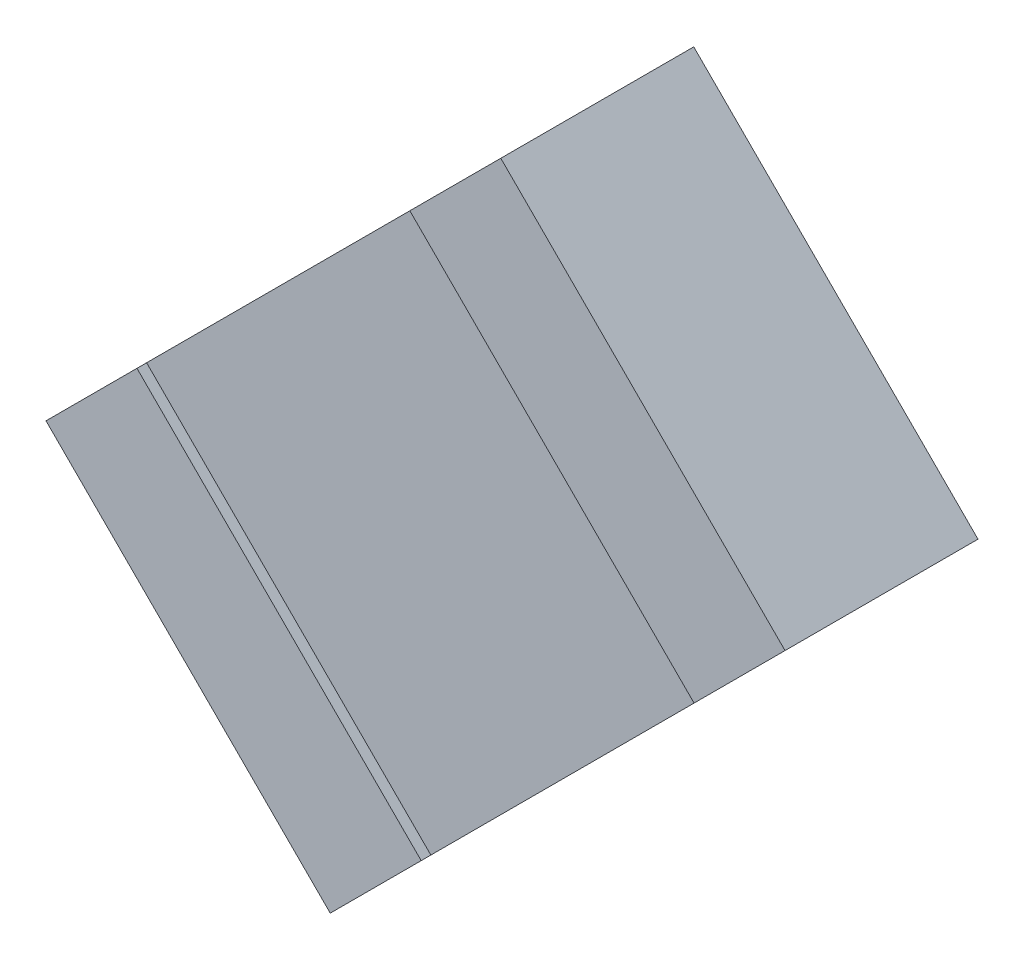
ISO-10303-21;
HEADER;
FILE_DESCRIPTION(('STEP AP214'),'2;1');
FILE_NAME('part.step','',(''),(''),'','','');
FILE_SCHEMA(('AUTOMOTIVE_DESIGN { 1 0 10303 214 1 1 1 1 }'));
ENDSEC;
DATA;
#1=APPLICATION_CONTEXT('core data for automotive mechanical design processes');
#2=APPLICATION_PROTOCOL_DEFINITION('international standard','automotive_design',2000,#1);
#3=PRODUCT_CONTEXT('',#1,'mechanical');
#4=PRODUCT('Part','Part','',(#3));
#5=PRODUCT_RELATED_PRODUCT_CATEGORY('part','',(#4));
#6=PRODUCT_DEFINITION_FORMATION('','',#4);
#7=PRODUCT_DEFINITION_CONTEXT('part definition',#1,'design');
#8=PRODUCT_DEFINITION('design','',#6,#7);
#9=PRODUCT_DEFINITION_SHAPE('','',#8);
#10=(LENGTH_UNIT() NAMED_UNIT(*) SI_UNIT(.MILLI.,.METRE.));
#11=(NAMED_UNIT(*) PLANE_ANGLE_UNIT() SI_UNIT($,.RADIAN.));
#12=(NAMED_UNIT(*) SI_UNIT($,.STERADIAN.) SOLID_ANGLE_UNIT());
#13=UNCERTAINTY_MEASURE_WITH_UNIT(LENGTH_MEASURE(1.E-05),#10,'distance_accuracy_value','');
#14=(GEOMETRIC_REPRESENTATION_CONTEXT(3) GLOBAL_UNCERTAINTY_ASSIGNED_CONTEXT((#13)) GLOBAL_UNIT_ASSIGNED_CONTEXT((#10,
#11,#12)) REPRESENTATION_CONTEXT('',''));
#15=CARTESIAN_POINT('',(0.,0.,0.));
#16=DIRECTION('',(0.,0.,1.));
#17=DIRECTION('',(1.,0.,0.));
#18=AXIS2_PLACEMENT_3D('',#15,#16,#17);
#19=CARTESIAN_POINT('',(-21.9197411277336,-0.377089043300944,1.04805716622663E-06));
#20=DIRECTION('',(-0.707106781186547,0.707106781186547,1.81058576561484E-08));
#21=DIRECTION('',(0.707106781186545,0.707106781186545,6.18172119636202E-08));
#22=AXIS2_PLACEMENT_3D('',#19,#20,#21);
#23=PLANE('',#22);
#24=DIRECTION('',(3.09085950456612E-08,5.65141445013829E-08,-1.));
#25=VECTOR('',#24,1.);
#26=CARTESIAN_POINT('',(-21.4954770580944,0.0471750271064109,-0.0299989148525065));
#27=LINE('',#26,#25);
#28=CARTESIAN_POINT('',(-21.4954770590217,0.0471750254109893,1.08514749313018E-06));
#29=VERTEX_POINT('',#28);
#30=CARTESIAN_POINT('',(-21.4954770580944,0.0471750271064109,-0.0299989148525065));
#31=VERTEX_POINT('',#30);
#32=EDGE_CURVE('P0_E105',#29,#31,#27,.T.);
#33=ORIENTED_EDGE('',*,*,#32,.F.);
#34=DIRECTION('',(-0.707106781186545,-0.707106781186545,-6.18172122697819E-08));
#35=VECTOR('',#34,1.);
#36=CARTESIAN_POINT('',(-21.4954770590217,0.0471750254109893,1.08514749313018E-06));
#37=LINE('',#36,#35);
#38=CARTESIAN_POINT('',(-21.2126343465471,0.330017737885602,1.10987437816623E-06));
#39=VERTEX_POINT('',#38);
#40=EDGE_CURVE('P0_E28',#39,#29,#37,.T.);
#41=ORIENTED_EDGE('',*,*,#40,.F.);
#42=DIRECTION('',(-3.09085950456612E-08,-5.65141445013829E-08,1.));
#43=VECTOR('',#42,1.);
#44=CARTESIAN_POINT('',(-21.2126343465471,0.330017737885602,1.10987437816623E-06));
#45=LINE('',#44,#43);
#46=CARTESIAN_POINT('',(-21.2126343280019,0.330017771794089,-0.599998890125621));
#47=VERTEX_POINT('',#46);
#48=EDGE_CURVE('P0_E82',#47,#39,#45,.T.);
#49=ORIENTED_EDGE('',*,*,#48,.F.);
#50=DIRECTION('',(0.707106781186545,0.707106781186545,6.18172119636202E-08));
#51=VECTOR('',#50,1.);
#52=CARTESIAN_POINT('',(-21.2126343280019,0.330017771794089,-0.599998890125621));
#53=LINE('',#52,#51);
#54=CARTESIAN_POINT('',(-21.4954770404765,0.0471750593194764,-0.599998914852506));
#55=VERTEX_POINT('',#54);
#56=EDGE_CURVE('P0_E75',#55,#47,#53,.T.);
#57=ORIENTED_EDGE('',*,*,#56,.F.);
#58=CARTESIAN_POINT('',(-21.4954770414038,0.0471750576240548,-0.569998914852506));
#59=VERTEX_POINT('',#58);
#60=EDGE_CURVE('P0_E79',#59,#55,#27,.T.);
#61=ORIENTED_EDGE('',*,*,#60,.F.);
#62=DIRECTION('',(-0.707106781186545,-0.707106781186545,-6.18172119636202E-08));
#63=VECTOR('',#62,1.);
#64=CARTESIAN_POINT('',(-21.2338475323648,0.308804566663073,-0.569998891980138));
#65=LINE('',#64,#63);
#66=CARTESIAN_POINT('',(-21.2338475323648,0.308804566663073,-0.569998891980138));
#67=VERTEX_POINT('',#66);
#68=EDGE_CURVE('P0_E120',#67,#59,#65,.T.);
#69=ORIENTED_EDGE('',*,*,#68,.F.);
#70=DIRECTION('',(3.09085950456612E-08,5.65141445013829E-08,-1.));
#71=VECTOR('',#70,1.);
#72=CARTESIAN_POINT('',(-21.2338475490554,0.30880453614543,-0.029998891980138));
#73=LINE('',#72,#71);
#74=CARTESIAN_POINT('',(-21.2338475490554,0.30880453614543,-0.029998891980138));
#75=VERTEX_POINT('',#74);
#76=EDGE_CURVE('P0_E126',#75,#67,#73,.T.);
#77=ORIENTED_EDGE('',*,*,#76,.F.);
#78=DIRECTION('',(0.707106781186545,0.707106781186545,6.18172120826627E-08));
#79=VECTOR('',#78,1.);
#80=CARTESIAN_POINT('',(-21.4954770580944,0.0471750271064109,-0.0299989148525065));
#81=LINE('',#80,#79);
#82=EDGE_CURVE('P0_E134',#31,#75,#81,.T.);
#83=ORIENTED_EDGE('',*,*,#82,.F.);
#84=EDGE_LOOP('',(#33,#41,#49,#57,#61,#69,#77,#83));
#85=FACE_BOUND('',#84,.T.);
#86=ADVANCED_FACE('P0_F17',(#85),#23,.T.);
#87=CARTESIAN_POINT('',(-21.0358576512505,-1.26097251978413,1.02542484399504E-06));
#88=DIRECTION('',(-0.707106781186547,0.707106781186547,1.81058576561484E-08));
#89=DIRECTION('',(0.707106781186545,0.707106781186545,6.18172119636202E-08));
#90=AXIS2_PLACEMENT_3D('',#87,#88,#89);
#91=PLANE('',#90);
#92=DIRECTION('',(3.09085950456612E-08,5.65141445013829E-08,-1.));
#93=VECTOR('',#92,1.);
#94=CARTESIAN_POINT('',(-20.6115935816112,-0.836708449376777,-0.0299989374848287));
#95=LINE('',#94,#93);
#96=CARTESIAN_POINT('',(-20.6115935825385,-0.836708451072199,1.06251517133227E-06));
#97=VERTEX_POINT('',#96);
#98=CARTESIAN_POINT('',(-20.6115935816112,-0.836708449376777,-0.0299989374848287));
#99=VERTEX_POINT('',#98);
#100=EDGE_CURVE('P0_E180',#97,#99,#95,.T.);
#101=ORIENTED_EDGE('',*,*,#100,.T.);
#102=DIRECTION('',(0.707106781186545,0.707106781186545,6.18172120826627E-08));
#103=VECTOR('',#102,1.);
#104=CARTESIAN_POINT('',(-20.6115935816112,-0.836708449376777,-0.0299989374848287));
#105=LINE('',#104,#103);
#106=CARTESIAN_POINT('',(-20.3499640725723,-0.575078940337759,-0.0299989146124603));
#107=VERTEX_POINT('',#106);
#108=EDGE_CURVE('P0_E131',#99,#107,#105,.T.);
#109=ORIENTED_EDGE('',*,*,#108,.T.);
#110=DIRECTION('',(3.09085950456612E-08,5.65141445013829E-08,-1.));
#111=VECTOR('',#110,1.);
#112=CARTESIAN_POINT('',(-20.3499640725723,-0.575078940337759,-0.0299989146124603));
#113=LINE('',#112,#111);
#114=CARTESIAN_POINT('',(-20.3499640558816,-0.575078909820115,-0.56999891461246));
#115=VERTEX_POINT('',#114);
#116=EDGE_CURVE('P0_E123',#107,#115,#113,.T.);
#117=ORIENTED_EDGE('',*,*,#116,.T.);
#118=DIRECTION('',(-0.707106781186545,-0.707106781186545,-6.18172119636202E-08));
#119=VECTOR('',#118,1.);
#120=CARTESIAN_POINT('',(-20.3499640558816,-0.575078909820115,-0.56999891461246));
#121=LINE('',#120,#119);
#122=CARTESIAN_POINT('',(-20.6115935649206,-0.836708418859133,-0.569998937484828));
#123=VERTEX_POINT('',#122);
#124=EDGE_CURVE('P0_E96',#115,#123,#121,.T.);
#125=ORIENTED_EDGE('',*,*,#124,.T.);
#126=DIRECTION('',(3.09085950456612E-08,5.65141445013829E-08,-1.));
#127=VECTOR('',#126,1.);
#128=CARTESIAN_POINT('',(-20.6115935825385,-0.836708451072199,1.06251517133227E-06));
#129=LINE('',#128,#127);
#130=CARTESIAN_POINT('',(-20.6115935639933,-0.836708417163712,-0.599998937484828));
#131=VERTEX_POINT('',#130);
#132=EDGE_CURVE('P0_E86',#123,#131,#129,.T.);
#133=ORIENTED_EDGE('',*,*,#132,.T.);
#134=DIRECTION('',(0.707106781186545,0.707106781186545,6.18172119636202E-08));
#135=VECTOR('',#134,1.);
#136=CARTESIAN_POINT('',(-20.3287508515188,-0.553865704689099,-0.599998912757944));
#137=LINE('',#136,#135);
#138=CARTESIAN_POINT('',(-20.3287508515188,-0.553865704689099,-0.599998912757944));
#139=VERTEX_POINT('',#138);
#140=EDGE_CURVE('P0_E67',#131,#139,#137,.T.);
#141=ORIENTED_EDGE('',*,*,#140,.T.);
#142=DIRECTION('',(-3.09085950456612E-08,-5.65141445013829E-08,1.));
#143=VECTOR('',#142,1.);
#144=CARTESIAN_POINT('',(-20.3287508700639,-0.553865738597587,1.08724205636831E-06));
#145=LINE('',#144,#143);
#146=CARTESIAN_POINT('',(-20.3287508700639,-0.553865738597587,1.08724205636831E-06));
#147=VERTEX_POINT('',#146);
#148=EDGE_CURVE('P0_E110',#139,#147,#145,.T.);
#149=ORIENTED_EDGE('',*,*,#148,.T.);
#150=DIRECTION('',(-0.707106781186545,-0.707106781186545,-6.18172122697819E-08));
#151=VECTOR('',#150,1.);
#152=CARTESIAN_POINT('',(-20.6115935825385,-0.836708451072199,1.06251517133227E-06));
#153=LINE('',#152,#151);
#154=EDGE_CURVE('P0_E11',#147,#97,#153,.T.);
#155=ORIENTED_EDGE('',*,*,#154,.T.);
#156=EDGE_LOOP('',(#101,#109,#117,#125,#133,#141,#149,#155));
#157=FACE_BOUND('',#156,.T.);
#158=ADVANCED_FACE('P0_F146',(#157),#91,.F.);
#159=CARTESIAN_POINT('',(-20.6115935825385,-0.836708451072199,1.06251517133227E-06));
#160=DIRECTION('',(3.09085952621502E-08,5.6514144717872E-08,-1.));
#161=DIRECTION('',(0.707106781186545,0.707106781186545,6.18172122697819E-08));
#162=AXIS2_PLACEMENT_3D('',#159,#160,#161);
#163=PLANE('',#162);
#164=ORIENTED_EDGE('',*,*,#40,.T.);
#165=DIRECTION('',(-0.707106781186547,0.707106781186547,1.81058576561484E-08));
#166=VECTOR('',#165,1.);
#167=CARTESIAN_POINT('',(-20.6115935825385,-0.836708451072199,1.06251517133227E-06));
#168=LINE('',#167,#166);
#169=EDGE_CURVE('P0_E139',#97,#29,#168,.T.);
#170=ORIENTED_EDGE('',*,*,#169,.F.);
#171=ORIENTED_EDGE('',*,*,#154,.F.);
#172=DIRECTION('',(-0.707106781186547,0.707106781186547,1.81058576561484E-08));
#173=VECTOR('',#172,1.);
#174=CARTESIAN_POINT('',(-20.3287508700639,-0.553865738597587,1.08724205636831E-06));
#175=LINE('',#174,#173);
#176=EDGE_CURVE('P0_E115',#147,#39,#175,.T.);
#177=ORIENTED_EDGE('',*,*,#176,.T.);
#178=EDGE_LOOP('',(#164,#170,#171,#177));
#179=FACE_BOUND('',#178,.T.);
#180=ADVANCED_FACE('P0_F205',(#179),#163,.F.);
#181=CARTESIAN_POINT('',(-20.3287508700639,-0.553865738597587,1.08724205636831E-06));
#182=DIRECTION('',(-0.707106781186545,-0.707106781186545,-6.18172119636202E-08));
#183=DIRECTION('',(-0.707106781186547,0.707106781186547,1.81058576561484E-08));
#184=AXIS2_PLACEMENT_3D('',#181,#182,#183);
#185=PLANE('',#184);
#186=ORIENTED_EDGE('',*,*,#48,.T.);
#187=ORIENTED_EDGE('',*,*,#176,.F.);
#188=ORIENTED_EDGE('',*,*,#148,.F.);
#189=DIRECTION('',(-0.707106781186547,0.707106781186547,1.81058576561484E-08));
#190=VECTOR('',#189,1.);
#191=CARTESIAN_POINT('',(-20.3287508515188,-0.553865704689099,-0.599998912757944));
#192=LINE('',#191,#190);
#193=EDGE_CURVE('P0_E85',#139,#47,#192,.T.);
#194=ORIENTED_EDGE('',*,*,#193,.T.);
#195=EDGE_LOOP('',(#186,#187,#188,#194));
#196=FACE_BOUND('',#195,.T.);
#197=ADVANCED_FACE('P0_F214',(#196),#185,.F.);
#198=CARTESIAN_POINT('',(-20.3287508515188,-0.553865704689099,-0.599998912757944));
#199=DIRECTION('',(-3.09085950456612E-08,-5.65141445013829E-08,1.));
#200=DIRECTION('',(-0.707106781186547,0.707106781186547,1.81058576561484E-08));
#201=AXIS2_PLACEMENT_3D('',#198,#199,#200);
#202=PLANE('',#201);
#203=ORIENTED_EDGE('',*,*,#56,.T.);
#204=ORIENTED_EDGE('',*,*,#193,.F.);
#205=ORIENTED_EDGE('',*,*,#140,.F.);
#206=DIRECTION('',(-0.707106781186547,0.707106781186547,1.81058576561484E-08));
#207=VECTOR('',#206,1.);
#208=CARTESIAN_POINT('',(-20.6115935639933,-0.836708417163712,-0.599998937484828));
#209=LINE('',#208,#207);
#210=EDGE_CURVE('P0_E89',#131,#55,#209,.T.);
#211=ORIENTED_EDGE('',*,*,#210,.T.);
#212=EDGE_LOOP('',(#203,#204,#205,#211));
#213=FACE_BOUND('',#212,.T.);
#214=ADVANCED_FACE('P0_F90',(#213),#202,.F.);
#215=CARTESIAN_POINT('',(-20.6115935816112,-0.836708449376777,-0.0299989374848287));
#216=DIRECTION('',(0.707106781186545,0.707106781186545,6.18172119636202E-08));
#217=DIRECTION('',(0.707106781186547,-0.707106781186547,-1.81058576561484E-08));
#218=AXIS2_PLACEMENT_3D('',#215,#216,#217);
#219=PLANE('',#218);
#220=ORIENTED_EDGE('',*,*,#60,.T.);
#221=ORIENTED_EDGE('',*,*,#210,.F.);
#222=ORIENTED_EDGE('',*,*,#132,.F.);
#223=DIRECTION('',(-0.707106781186547,0.707106781186547,1.81058576561484E-08));
#224=VECTOR('',#223,1.);
#225=CARTESIAN_POINT('',(-20.6115935649206,-0.836708418859133,-0.569998937484828));
#226=LINE('',#225,#224);
#227=EDGE_CURVE('P0_E21',#123,#59,#226,.T.);
#228=ORIENTED_EDGE('',*,*,#227,.T.);
#229=EDGE_LOOP('',(#220,#221,#222,#228));
#230=FACE_BOUND('',#229,.T.);
#231=ADVANCED_FACE('P0_F19',(#230),#219,.F.);
#232=CARTESIAN_POINT('',(-20.3499640558816,-0.575078909820115,-0.56999891461246));
#233=DIRECTION('',(3.09085950456612E-08,5.65141445013829E-08,-1.));
#234=DIRECTION('',(0.707106781186547,-0.707106781186547,-1.81058576561484E-08));
#235=AXIS2_PLACEMENT_3D('',#232,#233,#234);
#236=PLANE('',#235);
#237=ORIENTED_EDGE('',*,*,#68,.T.);
#238=ORIENTED_EDGE('',*,*,#227,.F.);
#239=ORIENTED_EDGE('',*,*,#124,.F.);
#240=DIRECTION('',(-0.707106781186547,0.707106781186547,1.81058576561484E-08));
#241=VECTOR('',#240,1.);
#242=CARTESIAN_POINT('',(-20.3499640558816,-0.575078909820115,-0.56999891461246));
#243=LINE('',#242,#241);
#244=EDGE_CURVE('P0_E130',#115,#67,#243,.T.);
#245=ORIENTED_EDGE('',*,*,#244,.T.);
#246=EDGE_LOOP('',(#237,#238,#239,#245));
#247=FACE_BOUND('',#246,.T.);
#248=ADVANCED_FACE('P0_F154',(#247),#236,.F.);
#249=CARTESIAN_POINT('',(-20.3499640725723,-0.575078940337759,-0.0299989146124603));
#250=DIRECTION('',(0.707106781186545,0.707106781186545,6.18172119636202E-08));
#251=DIRECTION('',(0.707106781186547,-0.707106781186547,-1.81058576561484E-08));
#252=AXIS2_PLACEMENT_3D('',#249,#250,#251);
#253=PLANE('',#252);
#254=ORIENTED_EDGE('',*,*,#76,.T.);
#255=ORIENTED_EDGE('',*,*,#244,.F.);
#256=ORIENTED_EDGE('',*,*,#116,.F.);
#257=DIRECTION('',(-0.707106781186547,0.707106781186547,1.81058576561484E-08));
#258=VECTOR('',#257,1.);
#259=CARTESIAN_POINT('',(-20.3499640725723,-0.575078940337759,-0.0299989146124603));
#260=LINE('',#259,#258);
#261=EDGE_CURVE('P0_E138',#107,#75,#260,.T.);
#262=ORIENTED_EDGE('',*,*,#261,.T.);
#263=EDGE_LOOP('',(#254,#255,#256,#262));
#264=FACE_BOUND('',#263,.T.);
#265=ADVANCED_FACE('P0_F248',(#264),#253,.F.);
#266=CARTESIAN_POINT('',(-20.6115935816112,-0.836708449376777,-0.0299989374848287));
#267=DIRECTION('',(-3.09085951298369E-08,-5.65141445855587E-08,1.));
#268=DIRECTION('',(-0.707106781186545,-0.707106781186545,-6.18172120826627E-08));
#269=AXIS2_PLACEMENT_3D('',#266,#267,#268);
#270=PLANE('',#269);
#271=ORIENTED_EDGE('',*,*,#82,.T.);
#272=ORIENTED_EDGE('',*,*,#261,.F.);
#273=ORIENTED_EDGE('',*,*,#108,.F.);
#274=DIRECTION('',(-0.707106781186547,0.707106781186547,1.81058576561484E-08));
#275=VECTOR('',#274,1.);
#276=CARTESIAN_POINT('',(-20.6115935816112,-0.836708449376777,-0.0299989374848287));
#277=LINE('',#276,#275);
#278=EDGE_CURVE('P0_E184',#99,#31,#277,.T.);
#279=ORIENTED_EDGE('',*,*,#278,.T.);
#280=EDGE_LOOP('',(#271,#272,#273,#279));
#281=FACE_BOUND('',#280,.T.);
#282=ADVANCED_FACE('P0_F257',(#281),#270,.F.);
#283=ORIENTED_EDGE('',*,*,#32,.T.);
#284=ORIENTED_EDGE('',*,*,#278,.F.);
#285=ORIENTED_EDGE('',*,*,#100,.F.);
#286=ORIENTED_EDGE('',*,*,#169,.T.);
#287=EDGE_LOOP('',(#283,#284,#285,#286));
#288=FACE_BOUND('',#287,.T.);
#289=ADVANCED_FACE('P0_F240',(#288),#219,.F.);
#290=CLOSED_SHELL('',(#86,#158,#180,#197,#214,#231,#248,#265,#282,#289));
#291=MANIFOLD_SOLID_BREP('P0_B1',#290);
#292=CARTESIAN_POINT('',(-22.6577857499618,1.73274273705185,-0.0299988555194181));
#293=DIRECTION('',(0.707106781186545,0.707106781186545,6.18172119636202E-08));
#294=DIRECTION('',(0.707106781186547,-0.707106781186547,-1.81058576561484E-08));
#295=AXIS2_PLACEMENT_3D('',#292,#293,#294);
#296=PLANE('',#295);
#297=DIRECTION('',(0.707106781186547,-0.707106781186547,-1.81058576561484E-08));
#298=VECTOR('',#297,1.);
#299=CARTESIAN_POINT('',(-22.6577857332712,1.73274276756949,-0.569998855519417));
#300=LINE('',#299,#298);
#301=CARTESIAN_POINT('',(-21.2338475323648,0.308804566663073,-0.569998891980138));
#302=VERTEX_POINT('',#301);
#303=CARTESIAN_POINT('',(-20.3499640558816,-0.575078909820115,-0.56999891461246));
#304=VERTEX_POINT('',#303);
#305=EDGE_CURVE('P1_E11',#302,#304,#300,.T.);
#306=ORIENTED_EDGE('',*,*,#305,.F.);
#307=DIRECTION('',(-3.09085950456612E-08,-5.65141445013829E-08,1.));
#308=VECTOR('',#307,1.);
#309=CARTESIAN_POINT('',(-21.2338475490554,0.30880453614543,-0.029998891980138));
#310=LINE('',#309,#308);
#311=CARTESIAN_POINT('',(-21.2338475490554,0.30880453614543,-0.029998891980138));
#312=VERTEX_POINT('',#311);
#313=EDGE_CURVE('P1_E108',#302,#312,#310,.T.);
#314=ORIENTED_EDGE('',*,*,#313,.T.);
#315=DIRECTION('',(0.707106781186547,-0.707106781186547,-1.81058576561484E-08));
#316=VECTOR('',#315,1.);
#317=CARTESIAN_POINT('',(-22.6577857499618,1.73274273705185,-0.0299988555194181));
#318=LINE('',#317,#316);
#319=CARTESIAN_POINT('',(-20.3499640725723,-0.575078940337759,-0.0299989146124603));
#320=VERTEX_POINT('',#319);
#321=EDGE_CURVE('P1_E64',#312,#320,#318,.T.);
#322=ORIENTED_EDGE('',*,*,#321,.T.);
#323=DIRECTION('',(-3.09085950456612E-08,-5.65141445013829E-08,1.));
#324=VECTOR('',#323,1.);
#325=CARTESIAN_POINT('',(-20.3499640725723,-0.575078940337759,-0.0299989146124603));
#326=LINE('',#325,#324);
#327=EDGE_CURVE('P1_E87',#304,#320,#326,.T.);
#328=ORIENTED_EDGE('',*,*,#327,.F.);
#329=EDGE_LOOP('',(#306,#314,#322,#328));
#330=FACE_BOUND('',#329,.T.);
#331=ADVANCED_FACE('P1_F17',(#330),#296,.T.);
#332=CARTESIAN_POINT('',(-22.6577857332712,1.73274276756949,-0.569998855519417));
#333=DIRECTION('',(3.09085950456612E-08,5.65141445013829E-08,-1.));
#334=DIRECTION('',(0.707106781186547,-0.707106781186547,-1.81058576561484E-08));
#335=AXIS2_PLACEMENT_3D('',#332,#333,#334);
#336=PLANE('',#335);
#337=DIRECTION('',(0.707106781186547,-0.707106781186547,-1.81058576561484E-08));
#338=VECTOR('',#337,1.);
#339=CARTESIAN_POINT('',(-24.0295728887731,0.360955612067587,-0.569998975444809));
#340=LINE('',#339,#338);
#341=CARTESIAN_POINT('',(-22.6056346878667,-1.06298258883883,-0.569999011905529));
#342=VERTEX_POINT('',#341);
#343=CARTESIAN_POINT('',(-21.7217512113835,-1.94686606532201,-0.569999034537851));
#344=VERTEX_POINT('',#343);
#345=EDGE_CURVE('P1_E27',#342,#344,#340,.T.);
#346=ORIENTED_EDGE('',*,*,#345,.F.);
#347=DIRECTION('',(0.707106781186545,0.707106781186545,6.18172119636202E-08));
#348=VECTOR('',#347,1.);
#349=CARTESIAN_POINT('',(-21.2338475323648,0.308804566663073,-0.569998891980138));
#350=LINE('',#349,#348);
#351=EDGE_CURVE('P1_E81',#342,#302,#350,.T.);
#352=ORIENTED_EDGE('',*,*,#351,.T.);
#353=ORIENTED_EDGE('',*,*,#305,.T.);
#354=DIRECTION('',(0.707106781186545,0.707106781186545,6.18172119636202E-08));
#355=VECTOR('',#354,1.);
#356=CARTESIAN_POINT('',(-20.3499640558816,-0.575078909820115,-0.56999891461246));
#357=LINE('',#356,#355);
#358=EDGE_CURVE('P1_E78',#344,#304,#357,.T.);
#359=ORIENTED_EDGE('',*,*,#358,.F.);
#360=EDGE_LOOP('',(#346,#352,#353,#359));
#361=FACE_BOUND('',#360,.T.);
#362=ADVANCED_FACE('P1_F77',(#361),#336,.T.);
#363=CARTESIAN_POINT('',(-24.0295729054638,0.360955581549944,-0.0299989754448094));
#364=DIRECTION('',(-0.707106781186545,-0.707106781186545,-6.18172119636202E-08));
#365=DIRECTION('',(-0.707106781186547,0.707106781186547,1.81058576561484E-08));
#366=AXIS2_PLACEMENT_3D('',#363,#364,#365);
#367=PLANE('',#366);
#368=DIRECTION('',(0.707106781186547,-0.707106781186547,-1.81058576561484E-08));
#369=VECTOR('',#368,1.);
#370=CARTESIAN_POINT('',(-24.0295729054638,0.360955581549944,-0.0299989754448094));
#371=LINE('',#370,#369);
#372=CARTESIAN_POINT('',(-22.6056347045573,-1.06298261935647,-0.0299990119055293));
#373=VERTEX_POINT('',#372);
#374=CARTESIAN_POINT('',(-21.7217512280742,-1.94686609583966,-0.0299990345378515));
#375=VERTEX_POINT('',#374);
#376=EDGE_CURVE('P1_E105',#373,#375,#371,.T.);
#377=ORIENTED_EDGE('',*,*,#376,.F.);
#378=DIRECTION('',(3.09085950456612E-08,5.65141445013829E-08,-1.));
#379=VECTOR('',#378,1.);
#380=CARTESIAN_POINT('',(-22.6056347045573,-1.06298261935647,-0.0299990119055293));
#381=LINE('',#380,#379);
#382=EDGE_CURVE('P1_E98',#373,#342,#381,.T.);
#383=ORIENTED_EDGE('',*,*,#382,.T.);
#384=ORIENTED_EDGE('',*,*,#345,.T.);
#385=DIRECTION('',(3.09085950456612E-08,5.65141445013829E-08,-1.));
#386=VECTOR('',#385,1.);
#387=CARTESIAN_POINT('',(-21.7217512280742,-1.94686609583966,-0.0299990345378515));
#388=LINE('',#387,#386);
#389=EDGE_CURVE('P1_E88',#375,#344,#388,.T.);
#390=ORIENTED_EDGE('',*,*,#389,.F.);
#391=EDGE_LOOP('',(#377,#383,#384,#390));
#392=FACE_BOUND('',#391,.T.);
#393=ADVANCED_FACE('P1_F141',(#392),#367,.T.);
#394=CARTESIAN_POINT('',(-22.6577857499618,1.73274273705185,-0.0299988555194181));
#395=DIRECTION('',(-3.09085950468961E-08,-5.65141445026179E-08,1.));
#396=DIRECTION('',(-0.707106781186545,-0.707106781186545,-6.18172119653667E-08));
#397=AXIS2_PLACEMENT_3D('',#394,#395,#396);
#398=PLANE('',#397);
#399=ORIENTED_EDGE('',*,*,#321,.F.);
#400=DIRECTION('',(-0.707106781186545,-0.707106781186545,-6.18172119653667E-08));
#401=VECTOR('',#400,1.);
#402=CARTESIAN_POINT('',(-21.2338475490554,0.30880453614543,-0.029998891980138));
#403=LINE('',#402,#401);
#404=EDGE_CURVE('P1_E93',#312,#373,#403,.T.);
#405=ORIENTED_EDGE('',*,*,#404,.T.);
#406=ORIENTED_EDGE('',*,*,#376,.T.);
#407=DIRECTION('',(-0.707106781186545,-0.707106781186545,-6.18172119653667E-08));
#408=VECTOR('',#407,1.);
#409=CARTESIAN_POINT('',(-20.3499640725723,-0.575078940337759,-0.0299989146124603));
#410=LINE('',#409,#408);
#411=EDGE_CURVE('P1_E92',#320,#375,#410,.T.);
#412=ORIENTED_EDGE('',*,*,#411,.F.);
#413=EDGE_LOOP('',(#399,#405,#406,#412));
#414=FACE_BOUND('',#413,.T.);
#415=ADVANCED_FACE('P1_F139',(#414),#398,.T.);
#416=CARTESIAN_POINT('',(-21.0358576512505,-1.26097251978413,1.02542484399504E-06));
#417=DIRECTION('',(-0.707106781186547,0.707106781186547,1.81058576561484E-08));
#418=DIRECTION('',(0.707106781186545,0.707106781186545,6.18172119636202E-08));
#419=AXIS2_PLACEMENT_3D('',#416,#417,#418);
#420=PLANE('',#419);
#421=ORIENTED_EDGE('',*,*,#327,.T.);
#422=ORIENTED_EDGE('',*,*,#411,.T.);
#423=ORIENTED_EDGE('',*,*,#389,.T.);
#424=ORIENTED_EDGE('',*,*,#358,.T.);
#425=EDGE_LOOP('',(#421,#422,#423,#424));
#426=FACE_BOUND('',#425,.T.);
#427=ADVANCED_FACE('P1_F85',(#426),#420,.F.);
#428=CARTESIAN_POINT('',(-21.9197411277336,-0.377089043300944,1.04805716622663E-06));
#429=DIRECTION('',(-0.707106781186547,0.707106781186547,1.81058576561484E-08));
#430=DIRECTION('',(0.707106781186545,0.707106781186545,6.18172119636202E-08));
#431=AXIS2_PLACEMENT_3D('',#428,#429,#430);
#432=PLANE('',#431);
#433=ORIENTED_EDGE('',*,*,#313,.F.);
#434=ORIENTED_EDGE('',*,*,#351,.F.);
#435=ORIENTED_EDGE('',*,*,#382,.F.);
#436=ORIENTED_EDGE('',*,*,#404,.F.);
#437=EDGE_LOOP('',(#433,#434,#435,#436));
#438=FACE_BOUND('',#437,.T.);
#439=ADVANCED_FACE('P1_F184',(#438),#432,.T.);
#440=CLOSED_SHELL('',(#331,#362,#393,#415,#427,#439));
#441=MANIFOLD_SOLID_BREP('P1_B1',#440);
#442=CARTESIAN_POINT('',(-21.9197411277336,-0.377089043300944,1.04805716622663E-06));
#443=DIRECTION('',(-0.707106781186547,0.707106781186547,1.81058576561484E-08));
#444=DIRECTION('',(-0.707106781186545,-0.707106781186545,-6.18172119636202E-08));
#445=AXIS2_PLACEMENT_3D('',#442,#443,#444);
#446=PLANE('',#445);
#447=DIRECTION('',(3.09085950456612E-08,5.65141445013829E-08,-1.));
#448=VECTOR('',#447,1.);
#449=CARTESIAN_POINT('',(-22.3440051955183,-0.801353110317454,-0.0299989890331612));
#450=LINE('',#449,#448);
#451=CARTESIAN_POINT('',(-22.3440051964456,-0.801353112012876,1.0109668388894E-06));
#452=VERTEX_POINT('',#451);
#453=CARTESIAN_POINT('',(-22.3440051955183,-0.801353110317454,-0.0299989890331612));
#454=VERTEX_POINT('',#453);
#455=EDGE_CURVE('P2_E178',#452,#454,#450,.T.);
#456=ORIENTED_EDGE('',*,*,#455,.T.);
#457=DIRECTION('',(-0.707106781186545,-0.707106781186545,-6.18172118445778E-08));
#458=VECTOR('',#457,1.);
#459=CARTESIAN_POINT('',(-22.3440051955183,-0.801353110317454,-0.0299989890331612));
#460=LINE('',#459,#458);
#461=CARTESIAN_POINT('',(-22.6056347045573,-1.06298261935647,-0.0299990119055293));
#462=VERTEX_POINT('',#461);
#463=EDGE_CURVE('P2_E175',#454,#462,#460,.T.);
#464=ORIENTED_EDGE('',*,*,#463,.T.);
#465=DIRECTION('',(3.09085950456612E-08,5.65141445013829E-08,-1.));
#466=VECTOR('',#465,1.);
#467=CARTESIAN_POINT('',(-22.6056347045573,-1.06298261935647,-0.0299990119055293));
#468=LINE('',#467,#466);
#469=CARTESIAN_POINT('',(-22.6056346878667,-1.06298258883883,-0.569999011905529));
#470=VERTEX_POINT('',#469);
#471=EDGE_CURVE('P2_E167',#462,#470,#468,.T.);
#472=ORIENTED_EDGE('',*,*,#471,.T.);
#473=DIRECTION('',(0.707106781186545,0.707106781186545,6.18172119636202E-08));
#474=VECTOR('',#473,1.);
#475=CARTESIAN_POINT('',(-22.6056346878667,-1.06298258883883,-0.569999011905529));
#476=LINE('',#475,#474);
#477=CARTESIAN_POINT('',(-22.3440051788277,-0.80135307979981,-0.56999898903316));
#478=VERTEX_POINT('',#477);
#479=EDGE_CURVE('P2_E153',#470,#478,#476,.T.);
#480=ORIENTED_EDGE('',*,*,#479,.T.);
#481=DIRECTION('',(3.09085950456612E-08,5.65141445013829E-08,-1.));
#482=VECTOR('',#481,1.);
#483=CARTESIAN_POINT('',(-22.3440051964456,-0.801353112012876,1.0109668388894E-06));
#484=LINE('',#483,#482);
#485=CARTESIAN_POINT('',(-22.3440051779004,-0.801353078104389,-0.599998989033161));
#486=VERTEX_POINT('',#485);
#487=EDGE_CURVE('P2_E80',#478,#486,#484,.T.);
#488=ORIENTED_EDGE('',*,*,#487,.T.);
#489=DIRECTION('',(-0.707106781186545,-0.707106781186545,-6.18172119636202E-08));
#490=VECTOR('',#489,1.);
#491=CARTESIAN_POINT('',(-22.626847890375,-1.084195790579,-0.599999013760045));
#492=LINE('',#491,#490);
#493=CARTESIAN_POINT('',(-22.626847890375,-1.084195790579,-0.599999013760045));
#494=VERTEX_POINT('',#493);
#495=EDGE_CURVE('P2_E120',#486,#494,#492,.T.);
#496=ORIENTED_EDGE('',*,*,#495,.T.);
#497=DIRECTION('',(-3.09085950456612E-08,-5.65141445013829E-08,1.));
#498=VECTOR('',#497,1.);
#499=CARTESIAN_POINT('',(-22.6268479089201,-1.08419582448749,9.86239954287038E-07));
#500=LINE('',#499,#498);
#501=CARTESIAN_POINT('',(-22.6268479089201,-1.08419582448749,9.86239954287038E-07));
#502=VERTEX_POINT('',#501);
#503=EDGE_CURVE('P2_E107',#494,#502,#500,.T.);
#504=ORIENTED_EDGE('',*,*,#503,.T.);
#505=DIRECTION('',(0.707106781186545,0.707106781186545,6.18172116574585E-08));
#506=VECTOR('',#505,1.);
#507=CARTESIAN_POINT('',(-22.3440051964456,-0.801353112012876,1.0109668388894E-06));
#508=LINE('',#507,#506);
#509=EDGE_CURVE('P2_E28',#502,#452,#508,.T.);
#510=ORIENTED_EDGE('',*,*,#509,.T.);
#511=EDGE_LOOP('',(#456,#464,#472,#480,#488,#496,#504,#510));
#512=FACE_BOUND('',#511,.T.);
#513=ADVANCED_FACE('P2_F17',(#512),#446,.T.);
#514=CARTESIAN_POINT('',(-21.0358576512505,-1.26097251978413,1.02542484399504E-06));
#515=DIRECTION('',(-0.707106781186547,0.707106781186547,1.81058576561484E-08));
#516=DIRECTION('',(-0.707106781186545,-0.707106781186545,-6.18172119636202E-08));
#517=AXIS2_PLACEMENT_3D('',#514,#515,#516);
#518=PLANE('',#517);
#519=DIRECTION('',(3.09085950456612E-08,5.65141445013829E-08,-1.));
#520=VECTOR('',#519,1.);
#521=CARTESIAN_POINT('',(-21.4601217190351,-1.68523658680063,-0.029999011665483));
#522=LINE('',#521,#520);
#523=CARTESIAN_POINT('',(-21.4601217199623,-1.68523658849605,9.88334517091488E-07));
#524=VERTEX_POINT('',#523);
#525=CARTESIAN_POINT('',(-21.4601217190351,-1.68523658680063,-0.029999011665483));
#526=VERTEX_POINT('',#525);
#527=EDGE_CURVE('P2_E223',#524,#526,#522,.T.);
#528=ORIENTED_EDGE('',*,*,#527,.F.);
#529=DIRECTION('',(0.707106781186545,0.707106781186545,6.18172116574585E-08));
#530=VECTOR('',#529,1.);
#531=CARTESIAN_POINT('',(-21.4601217199623,-1.68523658849605,9.88334517091488E-07));
#532=LINE('',#531,#530);
#533=CARTESIAN_POINT('',(-21.742964432437,-1.96807930097067,9.63607632055441E-07));
#534=VERTEX_POINT('',#533);
#535=EDGE_CURVE('P2_E11',#534,#524,#532,.T.);
#536=ORIENTED_EDGE('',*,*,#535,.F.);
#537=DIRECTION('',(-3.09085950456612E-08,-5.65141445013829E-08,1.));
#538=VECTOR('',#537,1.);
#539=CARTESIAN_POINT('',(-21.742964432437,-1.96807930097067,9.63607632055441E-07));
#540=LINE('',#539,#538);
#541=CARTESIAN_POINT('',(-21.7429644138918,-1.96807926706219,-0.599999036392367));
#542=VERTEX_POINT('',#541);
#543=EDGE_CURVE('P2_E100',#542,#534,#540,.T.);
#544=ORIENTED_EDGE('',*,*,#543,.F.);
#545=DIRECTION('',(-0.707106781186545,-0.707106781186545,-6.18172119636202E-08));
#546=VECTOR('',#545,1.);
#547=CARTESIAN_POINT('',(-21.7429644138918,-1.96807926706219,-0.599999036392367));
#548=LINE('',#547,#546);
#549=CARTESIAN_POINT('',(-21.4601217014172,-1.68523655458757,-0.599999011665483));
#550=VERTEX_POINT('',#549);
#551=EDGE_CURVE('P2_E121',#550,#542,#548,.T.);
#552=ORIENTED_EDGE('',*,*,#551,.F.);
#553=CARTESIAN_POINT('',(-21.4601217023445,-1.685236556283,-0.569999011665483));
#554=VERTEX_POINT('',#553);
#555=EDGE_CURVE('P2_E71',#554,#550,#522,.T.);
#556=ORIENTED_EDGE('',*,*,#555,.F.);
#557=DIRECTION('',(0.707106781186545,0.707106781186545,6.18172119636202E-08));
#558=VECTOR('',#557,1.);
#559=CARTESIAN_POINT('',(-21.7217512113835,-1.94686606532201,-0.569999034537851));
#560=LINE('',#559,#558);
#561=CARTESIAN_POINT('',(-21.7217512113835,-1.94686606532201,-0.569999034537851));
#562=VERTEX_POINT('',#561);
#563=EDGE_CURVE('P2_E88',#562,#554,#560,.T.);
#564=ORIENTED_EDGE('',*,*,#563,.F.);
#565=DIRECTION('',(3.09085950456612E-08,5.65141445013829E-08,-1.));
#566=VECTOR('',#565,1.);
#567=CARTESIAN_POINT('',(-21.7217512280742,-1.94686609583966,-0.0299990345378515));
#568=LINE('',#567,#566);
#569=CARTESIAN_POINT('',(-21.7217512280742,-1.94686609583966,-0.0299990345378515));
#570=VERTEX_POINT('',#569);
#571=EDGE_CURVE('P2_E163',#570,#562,#568,.T.);
#572=ORIENTED_EDGE('',*,*,#571,.F.);
#573=DIRECTION('',(-0.707106781186545,-0.707106781186545,-6.18172118445778E-08));
#574=VECTOR('',#573,1.);
#575=CARTESIAN_POINT('',(-21.4601217190351,-1.68523658680063,-0.029999011665483));
#576=LINE('',#575,#574);
#577=EDGE_CURVE('P2_E170',#526,#570,#576,.T.);
#578=ORIENTED_EDGE('',*,*,#577,.F.);
#579=EDGE_LOOP('',(#528,#536,#544,#552,#556,#564,#572,#578));
#580=FACE_BOUND('',#579,.T.);
#581=ADVANCED_FACE('P2_F258',(#580),#518,.F.);
#582=CARTESIAN_POINT('',(-21.4601217199623,-1.68523658849605,9.88334517091488E-07));
#583=DIRECTION('',(3.09085948291722E-08,5.65141442848939E-08,-1.));
#584=DIRECTION('',(-0.707106781186545,-0.707106781186545,-6.18172116574585E-08));
#585=AXIS2_PLACEMENT_3D('',#582,#583,#584);
#586=PLANE('',#585);
#587=ORIENTED_EDGE('',*,*,#509,.F.);
#588=DIRECTION('',(-0.707106781186547,0.707106781186547,1.81058576561484E-08));
#589=VECTOR('',#588,1.);
#590=CARTESIAN_POINT('',(-21.742964432437,-1.96807930097067,9.63607632055441E-07));
#591=LINE('',#590,#589);
#592=EDGE_CURVE('P2_E112',#534,#502,#591,.T.);
#593=ORIENTED_EDGE('',*,*,#592,.F.);
#594=ORIENTED_EDGE('',*,*,#535,.T.);
#595=DIRECTION('',(-0.707106781186547,0.707106781186547,1.81058576561484E-08));
#596=VECTOR('',#595,1.);
#597=CARTESIAN_POINT('',(-21.4601217199623,-1.68523658849605,9.88334517091488E-07));
#598=LINE('',#597,#596);
#599=EDGE_CURVE('P2_E181',#524,#452,#598,.T.);
#600=ORIENTED_EDGE('',*,*,#599,.T.);
#601=EDGE_LOOP('',(#587,#593,#594,#600));
#602=FACE_BOUND('',#601,.T.);
#603=ADVANCED_FACE('P2_F270',(#602),#586,.F.);
#604=CARTESIAN_POINT('',(-21.742964432437,-1.96807930097067,9.63607632055441E-07));
#605=DIRECTION('',(0.707106781186545,0.707106781186545,6.18172119636202E-08));
#606=DIRECTION('',(-0.707106781186547,0.707106781186547,1.81058576561484E-08));
#607=AXIS2_PLACEMENT_3D('',#604,#605,#606);
#608=PLANE('',#607);
#609=ORIENTED_EDGE('',*,*,#503,.F.);
#610=DIRECTION('',(-0.707106781186547,0.707106781186547,1.81058576561484E-08));
#611=VECTOR('',#610,1.);
#612=CARTESIAN_POINT('',(-21.7429644138918,-1.96807926706219,-0.599999036392367));
#613=LINE('',#612,#611);
#614=EDGE_CURVE('P2_E110',#542,#494,#613,.T.);
#615=ORIENTED_EDGE('',*,*,#614,.F.);
#616=ORIENTED_EDGE('',*,*,#543,.T.);
#617=ORIENTED_EDGE('',*,*,#592,.T.);
#618=EDGE_LOOP('',(#609,#615,#616,#617));
#619=FACE_BOUND('',#618,.T.);
#620=ADVANCED_FACE('P2_F109',(#619),#608,.F.);
#621=CARTESIAN_POINT('',(-21.7429644138918,-1.96807926706219,-0.599999036392367));
#622=DIRECTION('',(-3.09085950456612E-08,-5.65141445013829E-08,1.));
#623=DIRECTION('',(-0.707106781186547,0.707106781186547,1.81058576561484E-08));
#624=AXIS2_PLACEMENT_3D('',#621,#622,#623);
#625=PLANE('',#624);
#626=ORIENTED_EDGE('',*,*,#495,.F.);
#627=DIRECTION('',(-0.707106781186547,0.707106781186547,1.81058576561484E-08));
#628=VECTOR('',#627,1.);
#629=CARTESIAN_POINT('',(-21.4601217014172,-1.68523655458757,-0.599999011665483));
#630=LINE('',#629,#628);
#631=EDGE_CURVE('P2_E127',#550,#486,#630,.T.);
#632=ORIENTED_EDGE('',*,*,#631,.F.);
#633=ORIENTED_EDGE('',*,*,#551,.T.);
#634=ORIENTED_EDGE('',*,*,#614,.T.);
#635=EDGE_LOOP('',(#626,#632,#633,#634));
#636=FACE_BOUND('',#635,.T.);
#637=ADVANCED_FACE('P2_F118',(#636),#625,.F.);
#638=CARTESIAN_POINT('',(-21.4601217190351,-1.68523658680063,-0.029999011665483));
#639=DIRECTION('',(-0.707106781186545,-0.707106781186545,-6.18172119636202E-08));
#640=DIRECTION('',(0.707106781186547,-0.707106781186547,-1.81058576561484E-08));
#641=AXIS2_PLACEMENT_3D('',#638,#639,#640);
#642=PLANE('',#641);
#643=ORIENTED_EDGE('',*,*,#487,.F.);
#644=DIRECTION('',(-0.707106781186547,0.707106781186547,1.81058576561484E-08));
#645=VECTOR('',#644,1.);
#646=CARTESIAN_POINT('',(-21.4601217023445,-1.685236556283,-0.569999011665483));
#647=LINE('',#646,#645);
#648=EDGE_CURVE('P2_E21',#554,#478,#647,.T.);
#649=ORIENTED_EDGE('',*,*,#648,.F.);
#650=ORIENTED_EDGE('',*,*,#555,.T.);
#651=ORIENTED_EDGE('',*,*,#631,.T.);
#652=EDGE_LOOP('',(#643,#649,#650,#651));
#653=FACE_BOUND('',#652,.T.);
#654=ADVANCED_FACE('P2_F19',(#653),#642,.F.);
#655=CARTESIAN_POINT('',(-21.7217512113835,-1.94686606532201,-0.569999034537851));
#656=DIRECTION('',(3.09085950456612E-08,5.65141445013829E-08,-1.));
#657=DIRECTION('',(0.707106781186547,-0.707106781186547,-1.81058576561484E-08));
#658=AXIS2_PLACEMENT_3D('',#655,#656,#657);
#659=PLANE('',#658);
#660=ORIENTED_EDGE('',*,*,#479,.F.);
#661=DIRECTION('',(-0.707106781186547,0.707106781186547,1.81058576561484E-08));
#662=VECTOR('',#661,1.);
#663=CARTESIAN_POINT('',(-21.7217512113835,-1.94686606532201,-0.569999034537851));
#664=LINE('',#663,#662);
#665=EDGE_CURVE('P2_E157',#562,#470,#664,.T.);
#666=ORIENTED_EDGE('',*,*,#665,.F.);
#667=ORIENTED_EDGE('',*,*,#563,.T.);
#668=ORIENTED_EDGE('',*,*,#648,.T.);
#669=EDGE_LOOP('',(#660,#666,#667,#668));
#670=FACE_BOUND('',#669,.T.);
#671=ADVANCED_FACE('P2_F323',(#670),#659,.F.);
#672=CARTESIAN_POINT('',(-21.7217512280742,-1.94686609583966,-0.0299990345378515));
#673=DIRECTION('',(-0.707106781186545,-0.707106781186545,-6.18172119636202E-08));
#674=DIRECTION('',(0.707106781186547,-0.707106781186547,-1.81058576561484E-08));
#675=AXIS2_PLACEMENT_3D('',#672,#673,#674);
#676=PLANE('',#675);
#677=ORIENTED_EDGE('',*,*,#471,.F.);
#678=DIRECTION('',(-0.707106781186547,0.707106781186547,1.81058576561484E-08));
#679=VECTOR('',#678,1.);
#680=CARTESIAN_POINT('',(-21.7217512280742,-1.94686609583966,-0.0299990345378515));
#681=LINE('',#680,#679);
#682=EDGE_CURVE('P2_E174',#570,#462,#681,.T.);
#683=ORIENTED_EDGE('',*,*,#682,.F.);
#684=ORIENTED_EDGE('',*,*,#571,.T.);
#685=ORIENTED_EDGE('',*,*,#665,.T.);
#686=EDGE_LOOP('',(#677,#683,#684,#685));
#687=FACE_BOUND('',#686,.T.);
#688=ADVANCED_FACE('P2_F261',(#687),#676,.F.);
#689=CARTESIAN_POINT('',(-21.4601217190351,-1.68523658680063,-0.029999011665483));
#690=DIRECTION('',(-3.09085949614855E-08,-5.65141444172072E-08,1.));
#691=DIRECTION('',(0.707106781186545,0.707106781186545,6.18172118445778E-08));
#692=AXIS2_PLACEMENT_3D('',#689,#690,#691);
#693=PLANE('',#692);
#694=ORIENTED_EDGE('',*,*,#463,.F.);
#695=DIRECTION('',(-0.707106781186547,0.707106781186547,1.81058576561484E-08));
#696=VECTOR('',#695,1.);
#697=CARTESIAN_POINT('',(-21.4601217190351,-1.68523658680063,-0.029999011665483));
#698=LINE('',#697,#696);
#699=EDGE_CURVE('P2_E187',#526,#454,#698,.T.);
#700=ORIENTED_EDGE('',*,*,#699,.F.);
#701=ORIENTED_EDGE('',*,*,#577,.T.);
#702=ORIENTED_EDGE('',*,*,#682,.T.);
#703=EDGE_LOOP('',(#694,#700,#701,#702));
#704=FACE_BOUND('',#703,.T.);
#705=ADVANCED_FACE('P2_F262',(#704),#693,.F.);
#706=ORIENTED_EDGE('',*,*,#455,.F.);
#707=ORIENTED_EDGE('',*,*,#599,.F.);
#708=ORIENTED_EDGE('',*,*,#527,.T.);
#709=ORIENTED_EDGE('',*,*,#699,.T.);
#710=EDGE_LOOP('',(#706,#707,#708,#709));
#711=FACE_BOUND('',#710,.T.);
#712=ADVANCED_FACE('P2_F268',(#711),#642,.F.);
#713=CLOSED_SHELL('',(#513,#581,#603,#620,#637,#654,#671,#688,#705,#712));
#714=MANIFOLD_SOLID_BREP('P2_B1',#713);
#715=CARTESIAN_POINT('',(-22.6577857332712,1.73274276756949,-0.569998855519417));
#716=DIRECTION('',(3.09085950456612E-08,5.65141445013829E-08,-1.));
#717=DIRECTION('',(0.707106781186547,-0.707106781186547,-1.81058576561484E-08));
#718=AXIS2_PLACEMENT_3D('',#715,#716,#717);
#719=PLANE('',#718);
#720=DIRECTION('',(-0.707106781186547,0.707106781186548,1.81058576561484E-08));
#721=VECTOR('',#720,1.);
#722=CARTESIAN_POINT('',(-21.4954770414038,0.0471750576240548,-0.569998914852506));
#723=LINE('',#722,#721);
#724=CARTESIAN_POINT('',(-20.6115935649206,-0.836708418859133,-0.569998937484828));
#725=VERTEX_POINT('',#724);
#726=CARTESIAN_POINT('',(-21.4954770414038,0.0471750576240548,-0.569998914852506));
#727=VERTEX_POINT('',#726);
#728=EDGE_CURVE('P3_E103',#725,#727,#723,.T.);
#729=ORIENTED_EDGE('',*,*,#728,.T.);
#730=DIRECTION('',(-0.707106781186545,-0.707106781186545,-6.18172119636202E-08));
#731=VECTOR('',#730,1.);
#732=CARTESIAN_POINT('',(-21.4954770414038,0.0471750576240548,-0.569998914852506));
#733=LINE('',#732,#731);
#734=CARTESIAN_POINT('',(-22.3440051788277,-0.80135307979981,-0.56999898903316));
#735=VERTEX_POINT('',#734);
#736=EDGE_CURVE('P3_E62',#727,#735,#733,.T.);
#737=ORIENTED_EDGE('',*,*,#736,.T.);
#738=DIRECTION('',(0.707106781186547,-0.707106781186548,-1.81058576561484E-08));
#739=VECTOR('',#738,1.);
#740=CARTESIAN_POINT('',(-22.3440051788277,-0.80135307979981,-0.56999898903316));
#741=LINE('',#740,#739);
#742=CARTESIAN_POINT('',(-21.4601217023445,-1.685236556283,-0.569999011665483));
#743=VERTEX_POINT('',#742);
#744=EDGE_CURVE('P3_E84',#735,#743,#741,.T.);
#745=ORIENTED_EDGE('',*,*,#744,.T.);
#746=DIRECTION('',(0.707106781186545,0.707106781186545,6.18172119636202E-08));
#747=VECTOR('',#746,1.);
#748=CARTESIAN_POINT('',(-20.6115935649206,-0.836708418859133,-0.569998937484828));
#749=LINE('',#748,#747);
#750=EDGE_CURVE('P3_E27',#743,#725,#749,.T.);
#751=ORIENTED_EDGE('',*,*,#750,.T.);
#752=EDGE_LOOP('',(#729,#737,#745,#751));
#753=FACE_BOUND('',#752,.T.);
#754=ADVANCED_FACE('P3_F17',(#753),#719,.F.);
#755=CARTESIAN_POINT('',(-21.4777993709469,-0.81903074763405,-0.599998963258994));
#756=DIRECTION('',(3.09085949178867E-08,5.65141443736085E-08,-1.));
#757=DIRECTION('',(0.707106781186545,0.707106781186545,6.18172117829199E-08));
#758=AXIS2_PLACEMENT_3D('',#755,#756,#757);
#759=PLANE('',#758);
#760=DIRECTION('',(0.707106781186547,-0.707106781186548,-1.81058576561484E-08));
#761=VECTOR('',#760,1.);
#762=CARTESIAN_POINT('',(-21.4954770404765,0.0471750593194764,-0.599998914852506));
#763=LINE('',#762,#761);
#764=CARTESIAN_POINT('',(-21.4954770404765,0.0471750593194764,-0.599998914852506));
#765=VERTEX_POINT('',#764);
#766=CARTESIAN_POINT('',(-20.6115935639933,-0.836708417163712,-0.599998937484828));
#767=VERTEX_POINT('',#766);
#768=EDGE_CURVE('P3_E128',#765,#767,#763,.T.);
#769=ORIENTED_EDGE('',*,*,#768,.T.);
#770=DIRECTION('',(-0.707106781186545,-0.707106781186545,-6.18172117829199E-08));
#771=VECTOR('',#770,1.);
#772=CARTESIAN_POINT('',(-20.6115935639933,-0.836708417163712,-0.599998937484828));
#773=LINE('',#772,#771);
#774=CARTESIAN_POINT('',(-21.4601217014172,-1.68523655458757,-0.599999011665483));
#775=VERTEX_POINT('',#774);
#776=EDGE_CURVE('P3_E11',#767,#775,#773,.T.);
#777=ORIENTED_EDGE('',*,*,#776,.T.);
#778=DIRECTION('',(-0.707106781186547,0.707106781186548,1.81058576561484E-08));
#779=VECTOR('',#778,1.);
#780=CARTESIAN_POINT('',(-22.3440051779004,-0.801353078104389,-0.599998989033161));
#781=LINE('',#780,#779);
#782=CARTESIAN_POINT('',(-22.3440051779004,-0.801353078104389,-0.599998989033161));
#783=VERTEX_POINT('',#782);
#784=EDGE_CURVE('P3_E75',#775,#783,#781,.T.);
#785=ORIENTED_EDGE('',*,*,#784,.T.);
#786=DIRECTION('',(0.707106781186545,0.707106781186545,6.18172117829199E-08));
#787=VECTOR('',#786,1.);
#788=CARTESIAN_POINT('',(-21.4954770404765,0.0471750593194764,-0.599998914852506));
#789=LINE('',#788,#787);
#790=EDGE_CURVE('P3_E79',#783,#765,#789,.T.);
#791=ORIENTED_EDGE('',*,*,#790,.T.);
#792=EDGE_LOOP('',(#769,#777,#785,#791));
#793=FACE_BOUND('',#792,.T.);
#794=ADVANCED_FACE('P3_F77',(#793),#759,.T.);
#795=CARTESIAN_POINT('',(-20.6115936184781,-0.836708516785287,1.16277340763117));
#796=DIRECTION('',(0.707106781186547,-0.707106781186547,-1.81058576561484E-08));
#797=DIRECTION('',(-0.707106781186545,-0.707106781186545,-6.18172119636202E-08));
#798=AXIS2_PLACEMENT_3D('',#795,#796,#797);
#799=PLANE('',#798);
#800=ORIENTED_EDGE('',*,*,#750,.F.);
#801=DIRECTION('',(3.0908594975966E-08,5.65141444316878E-08,-1.));
#802=VECTOR('',#801,1.);
#803=CARTESIAN_POINT('',(-21.460121755902,-1.68523665420914,1.16277333345052));
#804=LINE('',#803,#802);
#805=EDGE_CURVE('P3_E83',#743,#775,#804,.T.);
#806=ORIENTED_EDGE('',*,*,#805,.T.);
#807=ORIENTED_EDGE('',*,*,#776,.F.);
#808=DIRECTION('',(3.0908594975966E-08,5.65141444316878E-08,-1.));
#809=VECTOR('',#808,1.);
#810=CARTESIAN_POINT('',(-20.6115936184781,-0.836708516785287,1.16277340763117));
#811=LINE('',#810,#809);
#812=EDGE_CURVE('P3_E106',#725,#767,#811,.T.);
#813=ORIENTED_EDGE('',*,*,#812,.F.);
#814=EDGE_LOOP('',(#800,#806,#807,#813));
#815=FACE_BOUND('',#814,.T.);
#816=ADVANCED_FACE('P3_F148',(#815),#799,.T.);
#817=CARTESIAN_POINT('',(-22.3440052323852,-0.801353177725964,1.16277335608284));
#818=DIRECTION('',(-0.707106781186546,-0.707106781186545,-6.18172118650564E-08));
#819=DIRECTION('',(-0.707106781186547,0.707106781186548,1.81058576561484E-08));
#820=AXIS2_PLACEMENT_3D('',#817,#818,#819);
#821=PLANE('',#820);
#822=ORIENTED_EDGE('',*,*,#744,.F.);
#823=DIRECTION('',(3.0908594975966E-08,5.65141444316878E-08,-1.));
#824=VECTOR('',#823,1.);
#825=CARTESIAN_POINT('',(-22.3440052323852,-0.801353177725964,1.16277335608284));
#826=LINE('',#825,#824);
#827=EDGE_CURVE('P3_E86',#735,#783,#826,.T.);
#828=ORIENTED_EDGE('',*,*,#827,.T.);
#829=ORIENTED_EDGE('',*,*,#784,.F.);
#830=ORIENTED_EDGE('',*,*,#805,.F.);
#831=EDGE_LOOP('',(#822,#828,#829,#830));
#832=FACE_BOUND('',#831,.T.);
#833=ADVANCED_FACE('P3_F87',(#832),#821,.T.);
#834=CARTESIAN_POINT('',(-21.4954770949614,0.0471749596978877,1.16277343026349));
#835=DIRECTION('',(-0.707106781186547,0.707106781186547,1.81058576561484E-08));
#836=DIRECTION('',(0.707106781186545,0.707106781186545,6.18172119636202E-08));
#837=AXIS2_PLACEMENT_3D('',#834,#835,#836);
#838=PLANE('',#837);
#839=ORIENTED_EDGE('',*,*,#736,.F.);
#840=DIRECTION('',(3.0908594975966E-08,5.65141444316878E-08,-1.));
#841=VECTOR('',#840,1.);
#842=CARTESIAN_POINT('',(-21.4954770949614,0.0471749596978877,1.16277343026349));
#843=LINE('',#842,#841);
#844=EDGE_CURVE('P3_E91',#727,#765,#843,.T.);
#845=ORIENTED_EDGE('',*,*,#844,.T.);
#846=ORIENTED_EDGE('',*,*,#790,.F.);
#847=ORIENTED_EDGE('',*,*,#827,.F.);
#848=EDGE_LOOP('',(#839,#845,#846,#847));
#849=FACE_BOUND('',#848,.T.);
#850=ADVANCED_FACE('P3_F90',(#849),#838,.T.);
#851=CARTESIAN_POINT('',(-21.4954770949614,0.0471749596978877,1.16277343026349));
#852=DIRECTION('',(0.707106781186546,0.707106781186545,6.18172118650564E-08));
#853=DIRECTION('',(0.707106781186547,-0.707106781186548,-1.81058576561484E-08));
#854=AXIS2_PLACEMENT_3D('',#851,#852,#853);
#855=PLANE('',#854);
#856=ORIENTED_EDGE('',*,*,#728,.F.);
#857=ORIENTED_EDGE('',*,*,#812,.T.);
#858=ORIENTED_EDGE('',*,*,#768,.F.);
#859=ORIENTED_EDGE('',*,*,#844,.F.);
#860=EDGE_LOOP('',(#856,#857,#858,#859));
#861=FACE_BOUND('',#860,.T.);
#862=ADVANCED_FACE('P3_F147',(#861),#855,.T.);
#863=CLOSED_SHELL('',(#754,#794,#816,#833,#850,#862));
#864=MANIFOLD_SOLID_BREP('P3_B1',#863);
#865=ADVANCED_BREP_SHAPE_REPRESENTATION('',(#18,#291,#441,#714,#864),#14);
#866=SHAPE_DEFINITION_REPRESENTATION(#9,#865);
ENDSEC;
END-ISO-10303-21;
